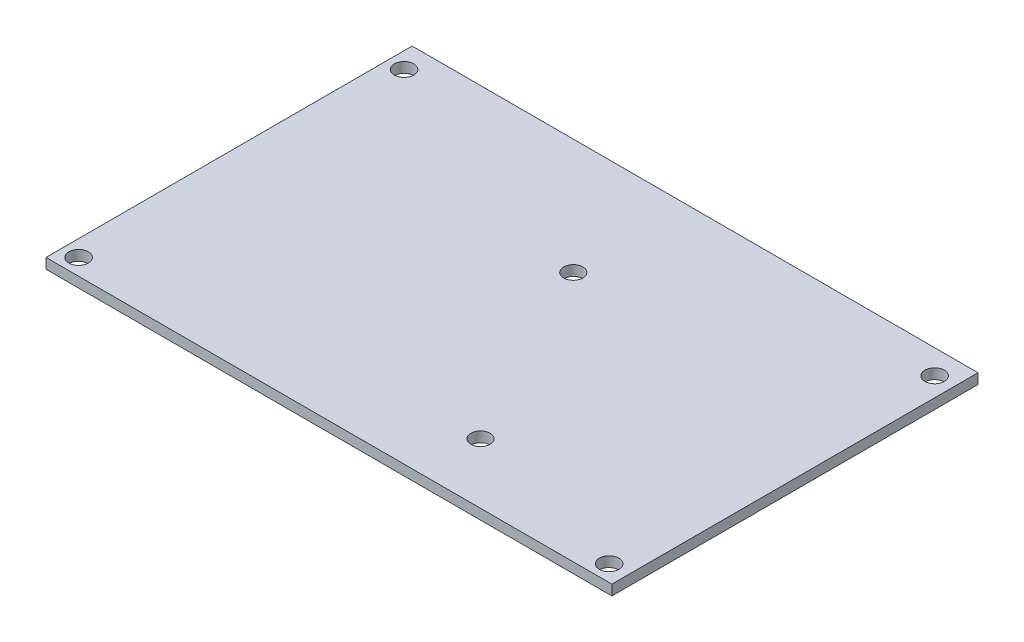
ISO-10303-21;
HEADER;
FILE_DESCRIPTION(('STEP AP214'),'2;1');
FILE_NAME('part.step','',(''),(''),'','','');
FILE_SCHEMA(('AUTOMOTIVE_DESIGN { 1 0 10303 214 1 1 1 1 }'));
ENDSEC;
DATA;
#1=APPLICATION_CONTEXT('core data for automotive mechanical design processes');
#2=APPLICATION_PROTOCOL_DEFINITION('international standard','automotive_design',2000,#1);
#3=PRODUCT_CONTEXT('',#1,'mechanical');
#4=PRODUCT('Part','Part','',(#3));
#5=PRODUCT_RELATED_PRODUCT_CATEGORY('part','',(#4));
#6=PRODUCT_DEFINITION_FORMATION('','',#4);
#7=PRODUCT_DEFINITION_CONTEXT('part definition',#1,'design');
#8=PRODUCT_DEFINITION('design','',#6,#7);
#9=PRODUCT_DEFINITION_SHAPE('','',#8);
#10=(LENGTH_UNIT() NAMED_UNIT(*) SI_UNIT(.MILLI.,.METRE.));
#11=(NAMED_UNIT(*) PLANE_ANGLE_UNIT() SI_UNIT($,.RADIAN.));
#12=(NAMED_UNIT(*) SI_UNIT($,.STERADIAN.) SOLID_ANGLE_UNIT());
#13=UNCERTAINTY_MEASURE_WITH_UNIT(LENGTH_MEASURE(1.E-05),#10,'distance_accuracy_value','');
#14=(GEOMETRIC_REPRESENTATION_CONTEXT(3) GLOBAL_UNCERTAINTY_ASSIGNED_CONTEXT((#13)) GLOBAL_UNIT_ASSIGNED_CONTEXT((#10,
#11,#12)) REPRESENTATION_CONTEXT('',''));
#15=CARTESIAN_POINT('',(0.,0.,0.));
#16=DIRECTION('',(0.,0.,1.));
#17=DIRECTION('',(1.,0.,0.));
#18=AXIS2_PLACEMENT_3D('',#15,#16,#17);
#19=CARTESIAN_POINT('',(0.,1.6,0.));
#20=DIRECTION('',(0.,1.,0.));
#21=DIRECTION('',(0.,0.,1.));
#22=AXIS2_PLACEMENT_3D('',#19,#20,#21);
#23=PLANE('',#22);
#24=CARTESIAN_POINT('',(59.944,1.6,-18.034));
#25=DIRECTION('',(0.,1.,0.));
#26=DIRECTION('',(0.,0.,1.));
#27=AXIS2_PLACEMENT_3D('',#24,#25,#26);
#28=CIRCLE('',#27,1.5);
#29=CARTESIAN_POINT('',(59.944,1.6,-16.534));
#30=VERTEX_POINT('',#29);
#31=EDGE_CURVE('E135',#30,#30,#28,.T.);
#32=ORIENTED_EDGE('',*,*,#31,.F.);
#33=EDGE_LOOP('',(#32));
#34=FACE_BOUND('',#33,.T.);
#35=CARTESIAN_POINT('',(86.868,1.6,-11.176));
#36=DIRECTION('',(0.,1.,0.));
#37=DIRECTION('',(0.,0.,1.));
#38=AXIS2_PLACEMENT_3D('',#35,#36,#37);
#39=CIRCLE('',#38,1.524);
#40=CARTESIAN_POINT('',(86.868,1.6,-9.652));
#41=VERTEX_POINT('',#40);
#42=EDGE_CURVE('E123',#41,#41,#39,.T.);
#43=ORIENTED_EDGE('',*,*,#42,.F.);
#44=EDGE_LOOP('',(#43));
#45=FACE_BOUND('',#44,.T.);
#46=CARTESIAN_POINT('',(4.064,1.6,-61.976));
#47=DIRECTION('',(0.,1.,0.));
#48=DIRECTION('',(0.,0.,1.));
#49=AXIS2_PLACEMENT_3D('',#46,#47,#48);
#50=CIRCLE('',#49,1.524);
#51=CARTESIAN_POINT('',(4.064,1.6,-60.452));
#52=VERTEX_POINT('',#51);
#53=EDGE_CURVE('E102',#52,#52,#50,.T.);
#54=ORIENTED_EDGE('',*,*,#53,.F.);
#55=EDGE_LOOP('',(#54));
#56=FACE_BOUND('',#55,.T.);
#57=DIRECTION('',(0.,0.,1.));
#58=VECTOR('',#57,1.);
#59=CARTESIAN_POINT('',(1.524,1.6,-65.776));
#60=LINE('',#59,#58);
#61=CARTESIAN_POINT('',(1.524,1.6,-65.776));
#62=VERTEX_POINT('',#61);
#63=CARTESIAN_POINT('',(1.524,1.6,-8.636));
#64=VERTEX_POINT('',#63);
#65=EDGE_CURVE('E87',#62,#64,#60,.T.);
#66=ORIENTED_EDGE('',*,*,#65,.T.);
#67=DIRECTION('',(1.,0.,0.));
#68=VECTOR('',#67,1.);
#69=CARTESIAN_POINT('',(1.524,1.6,-8.636));
#70=LINE('',#69,#68);
#71=CARTESIAN_POINT('',(89.84,1.6,-8.636));
#72=VERTEX_POINT('',#71);
#73=EDGE_CURVE('E82',#64,#72,#70,.T.);
#74=ORIENTED_EDGE('',*,*,#73,.T.);
#75=DIRECTION('',(0.,0.,-1.));
#76=VECTOR('',#75,1.);
#77=CARTESIAN_POINT('',(89.84,1.6,-8.636));
#78=LINE('',#77,#76);
#79=CARTESIAN_POINT('',(89.84,1.6,-65.776));
#80=VERTEX_POINT('',#79);
#81=EDGE_CURVE('E85',#72,#80,#78,.T.);
#82=ORIENTED_EDGE('',*,*,#81,.T.);
#83=DIRECTION('',(-1.,0.,0.));
#84=VECTOR('',#83,1.);
#85=CARTESIAN_POINT('',(89.84,1.6,-65.776));
#86=LINE('',#85,#84);
#87=EDGE_CURVE('E52',#80,#62,#86,.T.);
#88=ORIENTED_EDGE('',*,*,#87,.T.);
#89=EDGE_LOOP('',(#66,#74,#82,#88));
#90=FACE_BOUND('',#89,.T.);
#91=CARTESIAN_POINT('',(4.064,1.6,-11.176));
#92=DIRECTION('',(0.,1.,0.));
#93=DIRECTION('',(0.,0.,1.));
#94=AXIS2_PLACEMENT_3D('',#91,#92,#93);
#95=CIRCLE('',#94,1.524);
#96=CARTESIAN_POINT('',(4.064,1.6,-9.652));
#97=VERTEX_POINT('',#96);
#98=EDGE_CURVE('E117',#97,#97,#95,.T.);
#99=ORIENTED_EDGE('',*,*,#98,.F.);
#100=EDGE_LOOP('',(#99));
#101=FACE_BOUND('',#100,.T.);
#102=CARTESIAN_POINT('',(86.868,1.6,-61.976));
#103=DIRECTION('',(0.,1.,0.));
#104=DIRECTION('',(0.,0.,1.));
#105=AXIS2_PLACEMENT_3D('',#102,#103,#104);
#106=CIRCLE('',#105,1.524);
#107=CARTESIAN_POINT('',(86.868,1.6,-60.452));
#108=VERTEX_POINT('',#107);
#109=EDGE_CURVE('E129',#108,#108,#106,.T.);
#110=ORIENTED_EDGE('',*,*,#109,.F.);
#111=EDGE_LOOP('',(#110));
#112=FACE_BOUND('',#111,.T.);
#113=CARTESIAN_POINT('',(44.704,1.6,-47.752));
#114=DIRECTION('',(0.,1.,0.));
#115=DIRECTION('',(0.,0.,1.));
#116=AXIS2_PLACEMENT_3D('',#113,#114,#115);
#117=CIRCLE('',#116,1.5);
#118=CARTESIAN_POINT('',(44.704,1.6,-46.252));
#119=VERTEX_POINT('',#118);
#120=EDGE_CURVE('E141',#119,#119,#117,.T.);
#121=ORIENTED_EDGE('',*,*,#120,.F.);
#122=EDGE_LOOP('',(#121));
#123=FACE_BOUND('',#122,.T.);
#124=ADVANCED_FACE('F35',(#34,#45,#56,#90,#101,#112,#123),#23,.T.);
#125=CARTESIAN_POINT('',(0.,0.,0.));
#126=DIRECTION('',(0.,1.,0.));
#127=DIRECTION('',(0.,0.,1.));
#128=AXIS2_PLACEMENT_3D('',#125,#126,#127);
#129=PLANE('',#128);
#130=DIRECTION('',(0.,0.,1.));
#131=VECTOR('',#130,1.);
#132=CARTESIAN_POINT('',(1.524,0.,-65.776));
#133=LINE('',#132,#131);
#134=CARTESIAN_POINT('',(1.524,0.,-65.776));
#135=VERTEX_POINT('',#134);
#136=CARTESIAN_POINT('',(1.524,0.,-8.636));
#137=VERTEX_POINT('',#136);
#138=EDGE_CURVE('E99',#135,#137,#133,.T.);
#139=ORIENTED_EDGE('',*,*,#138,.F.);
#140=DIRECTION('',(-1.,0.,0.));
#141=VECTOR('',#140,1.);
#142=CARTESIAN_POINT('',(89.84,0.,-65.776));
#143=LINE('',#142,#141);
#144=CARTESIAN_POINT('',(89.84,0.,-65.776));
#145=VERTEX_POINT('',#144);
#146=EDGE_CURVE('E75',#145,#135,#143,.T.);
#147=ORIENTED_EDGE('',*,*,#146,.F.);
#148=DIRECTION('',(0.,0.,-1.));
#149=VECTOR('',#148,1.);
#150=CARTESIAN_POINT('',(89.84,0.,-8.636));
#151=LINE('',#150,#149);
#152=CARTESIAN_POINT('',(89.84,0.,-8.636));
#153=VERTEX_POINT('',#152);
#154=EDGE_CURVE('E69',#153,#145,#151,.T.);
#155=ORIENTED_EDGE('',*,*,#154,.F.);
#156=DIRECTION('',(1.,0.,0.));
#157=VECTOR('',#156,1.);
#158=CARTESIAN_POINT('',(1.524,0.,-8.636));
#159=LINE('',#158,#157);
#160=EDGE_CURVE('E91',#137,#153,#159,.T.);
#161=ORIENTED_EDGE('',*,*,#160,.F.);
#162=EDGE_LOOP('',(#139,#147,#155,#161));
#163=FACE_BOUND('',#162,.T.);
#164=CARTESIAN_POINT('',(4.064,0.,-61.976));
#165=DIRECTION('',(0.,1.,0.));
#166=DIRECTION('',(0.,0.,1.));
#167=AXIS2_PLACEMENT_3D('',#164,#165,#166);
#168=CIRCLE('',#167,1.524);
#169=CARTESIAN_POINT('',(4.064,0.,-60.452));
#170=VERTEX_POINT('',#169);
#171=EDGE_CURVE('E114',#170,#170,#168,.T.);
#172=ORIENTED_EDGE('',*,*,#171,.T.);
#173=EDGE_LOOP('',(#172));
#174=FACE_BOUND('',#173,.T.);
#175=CARTESIAN_POINT('',(4.064,0.,-11.176));
#176=DIRECTION('',(0.,1.,0.));
#177=DIRECTION('',(0.,0.,1.));
#178=AXIS2_PLACEMENT_3D('',#175,#176,#177);
#179=CIRCLE('',#178,1.524);
#180=CARTESIAN_POINT('',(4.064,0.,-9.652));
#181=VERTEX_POINT('',#180);
#182=EDGE_CURVE('E120',#181,#181,#179,.T.);
#183=ORIENTED_EDGE('',*,*,#182,.T.);
#184=EDGE_LOOP('',(#183));
#185=FACE_BOUND('',#184,.T.);
#186=CARTESIAN_POINT('',(86.868,0.,-11.176));
#187=DIRECTION('',(0.,1.,0.));
#188=DIRECTION('',(0.,0.,1.));
#189=AXIS2_PLACEMENT_3D('',#186,#187,#188);
#190=CIRCLE('',#189,1.524);
#191=CARTESIAN_POINT('',(86.868,0.,-9.652));
#192=VERTEX_POINT('',#191);
#193=EDGE_CURVE('E126',#192,#192,#190,.T.);
#194=ORIENTED_EDGE('',*,*,#193,.T.);
#195=EDGE_LOOP('',(#194));
#196=FACE_BOUND('',#195,.T.);
#197=CARTESIAN_POINT('',(86.868,0.,-61.976));
#198=DIRECTION('',(0.,1.,0.));
#199=DIRECTION('',(0.,0.,1.));
#200=AXIS2_PLACEMENT_3D('',#197,#198,#199);
#201=CIRCLE('',#200,1.524);
#202=CARTESIAN_POINT('',(86.868,0.,-60.452));
#203=VERTEX_POINT('',#202);
#204=EDGE_CURVE('E132',#203,#203,#201,.T.);
#205=ORIENTED_EDGE('',*,*,#204,.T.);
#206=EDGE_LOOP('',(#205));
#207=FACE_BOUND('',#206,.T.);
#208=CARTESIAN_POINT('',(59.944,0.,-18.034));
#209=DIRECTION('',(0.,1.,0.));
#210=DIRECTION('',(0.,0.,1.));
#211=AXIS2_PLACEMENT_3D('',#208,#209,#210);
#212=CIRCLE('',#211,1.5);
#213=CARTESIAN_POINT('',(59.944,0.,-16.534));
#214=VERTEX_POINT('',#213);
#215=EDGE_CURVE('E138',#214,#214,#212,.T.);
#216=ORIENTED_EDGE('',*,*,#215,.T.);
#217=EDGE_LOOP('',(#216));
#218=FACE_BOUND('',#217,.T.);
#219=CARTESIAN_POINT('',(44.704,0.,-47.752));
#220=DIRECTION('',(0.,1.,0.));
#221=DIRECTION('',(0.,0.,1.));
#222=AXIS2_PLACEMENT_3D('',#219,#220,#221);
#223=CIRCLE('',#222,1.5);
#224=CARTESIAN_POINT('',(44.704,0.,-46.252));
#225=VERTEX_POINT('',#224);
#226=EDGE_CURVE('E144',#225,#225,#223,.T.);
#227=ORIENTED_EDGE('',*,*,#226,.T.);
#228=EDGE_LOOP('',(#227));
#229=FACE_BOUND('',#228,.T.);
#230=ADVANCED_FACE('F110',(#163,#174,#185,#196,#207,#218,#229),#129,.F.);
#231=CARTESIAN_POINT('',(1.524,1.6,-65.776));
#232=DIRECTION('',(1.,0.,0.));
#233=DIRECTION('',(0.,0.,-1.));
#234=AXIS2_PLACEMENT_3D('',#231,#232,#233);
#235=PLANE('',#234);
#236=ORIENTED_EDGE('',*,*,#138,.T.);
#237=DIRECTION('',(0.,-1.,0.));
#238=VECTOR('',#237,1.);
#239=CARTESIAN_POINT('',(1.524,1.6,-8.636));
#240=LINE('',#239,#238);
#241=EDGE_CURVE('E11',#64,#137,#240,.T.);
#242=ORIENTED_EDGE('',*,*,#241,.F.);
#243=ORIENTED_EDGE('',*,*,#65,.F.);
#244=DIRECTION('',(0.,-1.,0.));
#245=VECTOR('',#244,1.);
#246=CARTESIAN_POINT('',(1.524,1.6,-65.776));
#247=LINE('',#246,#245);
#248=EDGE_CURVE('E95',#62,#135,#247,.T.);
#249=ORIENTED_EDGE('',*,*,#248,.T.);
#250=EDGE_LOOP('',(#236,#242,#243,#249));
#251=FACE_BOUND('',#250,.T.);
#252=ADVANCED_FACE('F37',(#251),#235,.F.);
#253=CARTESIAN_POINT('',(1.524,1.6,-8.636));
#254=DIRECTION('',(0.,0.,-1.));
#255=DIRECTION('',(-1.,0.,0.));
#256=AXIS2_PLACEMENT_3D('',#253,#254,#255);
#257=PLANE('',#256);
#258=ORIENTED_EDGE('',*,*,#160,.T.);
#259=DIRECTION('',(0.,-1.,0.));
#260=VECTOR('',#259,1.);
#261=CARTESIAN_POINT('',(89.84,1.6,-8.636));
#262=LINE('',#261,#260);
#263=EDGE_CURVE('E44',#72,#153,#262,.T.);
#264=ORIENTED_EDGE('',*,*,#263,.F.);
#265=ORIENTED_EDGE('',*,*,#73,.F.);
#266=ORIENTED_EDGE('',*,*,#241,.T.);
#267=EDGE_LOOP('',(#258,#264,#265,#266));
#268=FACE_BOUND('',#267,.T.);
#269=ADVANCED_FACE('F90',(#268),#257,.F.);
#270=CARTESIAN_POINT('',(89.84,1.6,-8.636));
#271=DIRECTION('',(-1.,0.,0.));
#272=DIRECTION('',(0.,0.,1.));
#273=AXIS2_PLACEMENT_3D('',#270,#271,#272);
#274=PLANE('',#273);
#275=ORIENTED_EDGE('',*,*,#154,.T.);
#276=DIRECTION('',(0.,-1.,0.));
#277=VECTOR('',#276,1.);
#278=CARTESIAN_POINT('',(89.84,1.6,-65.776));
#279=LINE('',#278,#277);
#280=EDGE_CURVE('E92',#80,#145,#279,.T.);
#281=ORIENTED_EDGE('',*,*,#280,.F.);
#282=ORIENTED_EDGE('',*,*,#81,.F.);
#283=ORIENTED_EDGE('',*,*,#263,.T.);
#284=EDGE_LOOP('',(#275,#281,#282,#283));
#285=FACE_BOUND('',#284,.T.);
#286=ADVANCED_FACE('F93',(#285),#274,.F.);
#287=CARTESIAN_POINT('',(89.84,1.6,-65.776));
#288=DIRECTION('',(0.,0.,1.));
#289=DIRECTION('',(1.,0.,0.));
#290=AXIS2_PLACEMENT_3D('',#287,#288,#289);
#291=PLANE('',#290);
#292=ORIENTED_EDGE('',*,*,#146,.T.);
#293=ORIENTED_EDGE('',*,*,#248,.F.);
#294=ORIENTED_EDGE('',*,*,#87,.F.);
#295=ORIENTED_EDGE('',*,*,#280,.T.);
#296=EDGE_LOOP('',(#292,#293,#294,#295));
#297=FACE_BOUND('',#296,.T.);
#298=ADVANCED_FACE('F107',(#297),#291,.F.);
#299=CARTESIAN_POINT('',(4.064,1.6,-61.976));
#300=DIRECTION('',(0.,-1.,0.));
#301=DIRECTION('',(0.,0.,-1.));
#302=AXIS2_PLACEMENT_3D('',#299,#300,#301);
#303=CYLINDRICAL_SURFACE('',#302,1.524);
#304=ORIENTED_EDGE('',*,*,#53,.T.);
#305=EDGE_LOOP('',(#304));
#306=FACE_BOUND('',#305,.T.);
#307=ORIENTED_EDGE('',*,*,#171,.F.);
#308=EDGE_LOOP('',(#307));
#309=FACE_BOUND('',#308,.T.);
#310=ADVANCED_FACE('F163',(#306,#309),#303,.F.);
#311=CARTESIAN_POINT('',(4.064,1.6,-11.176));
#312=DIRECTION('',(0.,-1.,0.));
#313=DIRECTION('',(0.,0.,-1.));
#314=AXIS2_PLACEMENT_3D('',#311,#312,#313);
#315=CYLINDRICAL_SURFACE('',#314,1.524);
#316=ORIENTED_EDGE('',*,*,#98,.T.);
#317=EDGE_LOOP('',(#316));
#318=FACE_BOUND('',#317,.T.);
#319=ORIENTED_EDGE('',*,*,#182,.F.);
#320=EDGE_LOOP('',(#319));
#321=FACE_BOUND('',#320,.T.);
#322=ADVANCED_FACE('F209',(#318,#321),#315,.F.);
#323=CARTESIAN_POINT('',(86.868,1.6,-11.176));
#324=DIRECTION('',(0.,-1.,0.));
#325=DIRECTION('',(0.,0.,-1.));
#326=AXIS2_PLACEMENT_3D('',#323,#324,#325);
#327=CYLINDRICAL_SURFACE('',#326,1.524);
#328=ORIENTED_EDGE('',*,*,#42,.T.);
#329=EDGE_LOOP('',(#328));
#330=FACE_BOUND('',#329,.T.);
#331=ORIENTED_EDGE('',*,*,#193,.F.);
#332=EDGE_LOOP('',(#331));
#333=FACE_BOUND('',#332,.T.);
#334=ADVANCED_FACE('F217',(#330,#333),#327,.F.);
#335=CARTESIAN_POINT('',(86.868,1.6,-61.976));
#336=DIRECTION('',(0.,-1.,0.));
#337=DIRECTION('',(0.,0.,-1.));
#338=AXIS2_PLACEMENT_3D('',#335,#336,#337);
#339=CYLINDRICAL_SURFACE('',#338,1.524);
#340=ORIENTED_EDGE('',*,*,#109,.T.);
#341=EDGE_LOOP('',(#340));
#342=FACE_BOUND('',#341,.T.);
#343=ORIENTED_EDGE('',*,*,#204,.F.);
#344=EDGE_LOOP('',(#343));
#345=FACE_BOUND('',#344,.T.);
#346=ADVANCED_FACE('F225',(#342,#345),#339,.F.);
#347=CARTESIAN_POINT('',(59.944,1.6,-18.034));
#348=DIRECTION('',(0.,-1.,0.));
#349=DIRECTION('',(0.,0.,-1.));
#350=AXIS2_PLACEMENT_3D('',#347,#348,#349);
#351=CYLINDRICAL_SURFACE('',#350,1.5);
#352=ORIENTED_EDGE('',*,*,#31,.T.);
#353=EDGE_LOOP('',(#352));
#354=FACE_BOUND('',#353,.T.);
#355=ORIENTED_EDGE('',*,*,#215,.F.);
#356=EDGE_LOOP('',(#355));
#357=FACE_BOUND('',#356,.T.);
#358=ADVANCED_FACE('F234',(#354,#357),#351,.F.);
#359=CARTESIAN_POINT('',(44.704,1.6,-47.752));
#360=DIRECTION('',(0.,-1.,0.));
#361=DIRECTION('',(0.,0.,-1.));
#362=AXIS2_PLACEMENT_3D('',#359,#360,#361);
#363=CYLINDRICAL_SURFACE('',#362,1.5);
#364=ORIENTED_EDGE('',*,*,#120,.T.);
#365=EDGE_LOOP('',(#364));
#366=FACE_BOUND('',#365,.T.);
#367=ORIENTED_EDGE('',*,*,#226,.F.);
#368=EDGE_LOOP('',(#367));
#369=FACE_BOUND('',#368,.T.);
#370=ADVANCED_FACE('F150',(#366,#369),#363,.F.);
#371=CLOSED_SHELL('',(#124,#230,#252,#269,#286,#298,#310,#322,#334,#346,#358,#370));
#372=MANIFOLD_SOLID_BREP('B2',#371);
#373=ADVANCED_BREP_SHAPE_REPRESENTATION('',(#18,#372),#14);
#374=SHAPE_DEFINITION_REPRESENTATION(#9,#373);
ENDSEC;
END-ISO-10303-21;
